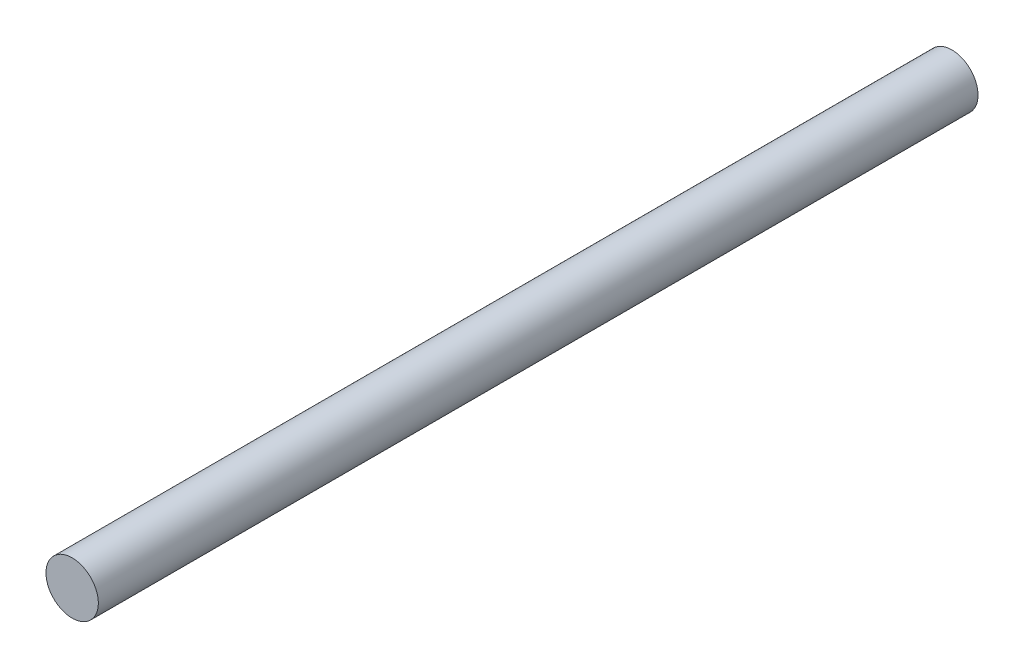
ISO-10303-21;
HEADER;
FILE_DESCRIPTION(('STEP AP214'),'2;1');
FILE_NAME('part.step','',(''),(''),'','','');
FILE_SCHEMA(('AUTOMOTIVE_DESIGN { 1 0 10303 214 1 1 1 1 }'));
ENDSEC;
DATA;
#1=APPLICATION_CONTEXT('core data for automotive mechanical design processes');
#2=APPLICATION_PROTOCOL_DEFINITION('international standard','automotive_design',2000,#1);
#3=PRODUCT_CONTEXT('',#1,'mechanical');
#4=PRODUCT('Part','Part','',(#3));
#5=PRODUCT_RELATED_PRODUCT_CATEGORY('part','',(#4));
#6=PRODUCT_DEFINITION_FORMATION('','',#4);
#7=PRODUCT_DEFINITION_CONTEXT('part definition',#1,'design');
#8=PRODUCT_DEFINITION('design','',#6,#7);
#9=PRODUCT_DEFINITION_SHAPE('','',#8);
#10=(LENGTH_UNIT() NAMED_UNIT(*) SI_UNIT(.MILLI.,.METRE.));
#11=(NAMED_UNIT(*) PLANE_ANGLE_UNIT() SI_UNIT($,.RADIAN.));
#12=(NAMED_UNIT(*) SI_UNIT($,.STERADIAN.) SOLID_ANGLE_UNIT());
#13=UNCERTAINTY_MEASURE_WITH_UNIT(LENGTH_MEASURE(1.E-05),#10,'distance_accuracy_value','');
#14=(GEOMETRIC_REPRESENTATION_CONTEXT(3) GLOBAL_UNCERTAINTY_ASSIGNED_CONTEXT((#13)) GLOBAL_UNIT_ASSIGNED_CONTEXT((#10,
#11,#12)) REPRESENTATION_CONTEXT('',''));
#15=CARTESIAN_POINT('',(0.,0.,0.));
#16=DIRECTION('',(0.,0.,1.));
#17=DIRECTION('',(1.,0.,0.));
#18=AXIS2_PLACEMENT_3D('',#15,#16,#17);
#19=CARTESIAN_POINT('',(-65.5082800911558,9.10927533451347,-234.95));
#20=DIRECTION('',(0.,0.,1.));
#21=DIRECTION('',(1.,0.,0.));
#22=AXIS2_PLACEMENT_3D('',#19,#20,#21);
#23=CYLINDRICAL_SURFACE('',#22,6.985);
#24=CARTESIAN_POINT('',(-65.5082800911558,9.10927533451347,-234.95));
#25=DIRECTION('',(0.,0.,-1.));
#26=DIRECTION('',(-1.,0.,0.));
#27=AXIS2_PLACEMENT_3D('',#24,#25,#26);
#28=CIRCLE('',#27,6.985);
#29=CARTESIAN_POINT('',(-72.4932800911558,9.10927533451347,-234.95));
#30=VERTEX_POINT('',#29);
#31=EDGE_CURVE('E8',#30,#30,#28,.T.);
#32=ORIENTED_EDGE('',*,*,#31,.F.);
#33=EDGE_LOOP('',(#32));
#34=FACE_BOUND('',#33,.T.);
#35=CARTESIAN_POINT('',(-65.5082800911558,9.10927533451347,0.));
#36=DIRECTION('',(0.,0.,-1.));
#37=DIRECTION('',(-1.,0.,0.));
#38=AXIS2_PLACEMENT_3D('',#35,#36,#37);
#39=CIRCLE('',#38,6.985);
#40=CARTESIAN_POINT('',(-72.4932800911558,9.10927533451347,0.));
#41=VERTEX_POINT('',#40);
#42=EDGE_CURVE('E16',#41,#41,#39,.T.);
#43=ORIENTED_EDGE('',*,*,#42,.T.);
#44=EDGE_LOOP('',(#43));
#45=FACE_BOUND('',#44,.T.);
#46=ADVANCED_FACE('F13',(#34,#45),#23,.T.);
#47=CARTESIAN_POINT('',(-65.5082800911558,9.10927533451347,-234.95));
#48=DIRECTION('',(0.,0.,-1.));
#49=DIRECTION('',(-1.,0.,0.));
#50=AXIS2_PLACEMENT_3D('',#47,#48,#49);
#51=PLANE('',#50);
#52=ORIENTED_EDGE('',*,*,#31,.T.);
#53=EDGE_LOOP('',(#52));
#54=FACE_BOUND('',#53,.T.);
#55=ADVANCED_FACE('F31',(#54),#51,.T.);
#56=CARTESIAN_POINT('',(-65.5082800911558,9.10927533451347,0.));
#57=DIRECTION('',(0.,0.,-1.));
#58=DIRECTION('',(-1.,0.,0.));
#59=AXIS2_PLACEMENT_3D('',#56,#57,#58);
#60=PLANE('',#59);
#61=ORIENTED_EDGE('',*,*,#42,.F.);
#62=EDGE_LOOP('',(#61));
#63=FACE_BOUND('',#62,.T.);
#64=ADVANCED_FACE('F29',(#63),#60,.F.);
#65=CLOSED_SHELL('',(#46,#55,#64));
#66=MANIFOLD_SOLID_BREP('B1',#65);
#67=ADVANCED_BREP_SHAPE_REPRESENTATION('',(#18,#66),#14);
#68=SHAPE_DEFINITION_REPRESENTATION(#9,#67);
ENDSEC;
END-ISO-10303-21;
